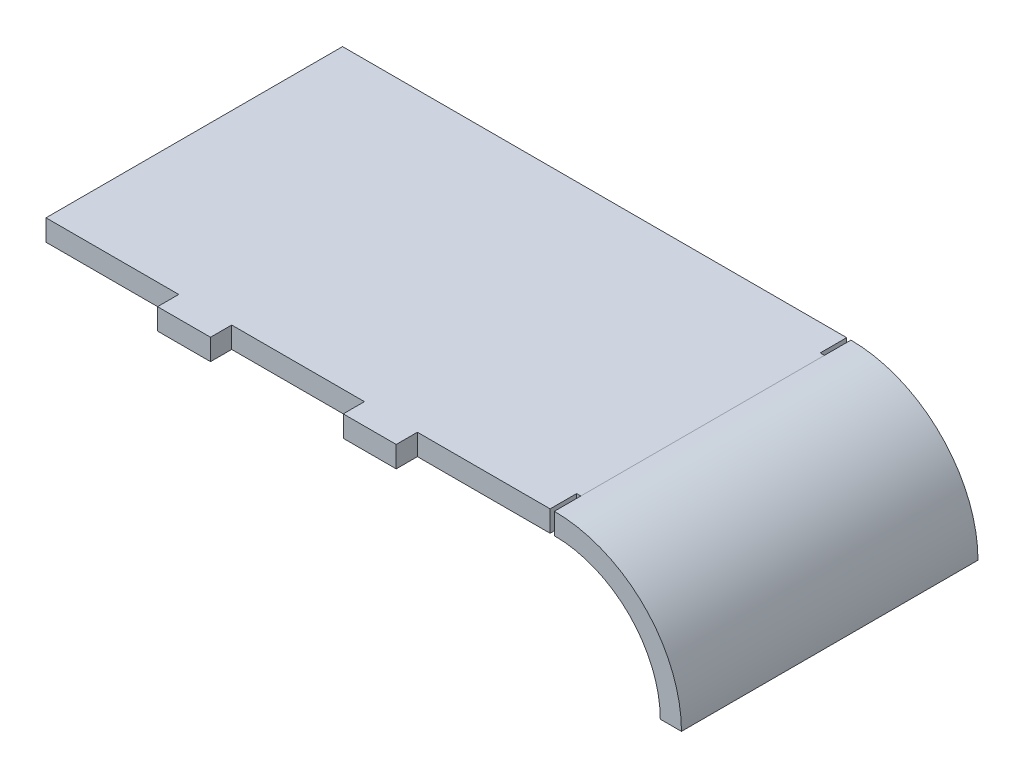
ISO-10303-21;
HEADER;
FILE_DESCRIPTION(('STEP AP214'),'2;1');
FILE_NAME('part.step','',(''),(''),'','','');
FILE_SCHEMA(('AUTOMOTIVE_DESIGN { 1 0 10303 214 1 1 1 1 }'));
ENDSEC;
DATA;
#1=APPLICATION_CONTEXT('core data for automotive mechanical design processes');
#2=APPLICATION_PROTOCOL_DEFINITION('international standard','automotive_design',2000,#1);
#3=PRODUCT_CONTEXT('',#1,'mechanical');
#4=PRODUCT('Part','Part','',(#3));
#5=PRODUCT_RELATED_PRODUCT_CATEGORY('part','',(#4));
#6=PRODUCT_DEFINITION_FORMATION('','',#4);
#7=PRODUCT_DEFINITION_CONTEXT('part definition',#1,'design');
#8=PRODUCT_DEFINITION('design','',#6,#7);
#9=PRODUCT_DEFINITION_SHAPE('','',#8);
#10=(LENGTH_UNIT() NAMED_UNIT(*) SI_UNIT(.MILLI.,.METRE.));
#11=(NAMED_UNIT(*) PLANE_ANGLE_UNIT() SI_UNIT($,.RADIAN.));
#12=(NAMED_UNIT(*) SI_UNIT($,.STERADIAN.) SOLID_ANGLE_UNIT());
#13=UNCERTAINTY_MEASURE_WITH_UNIT(LENGTH_MEASURE(1.E-05),#10,'distance_accuracy_value','');
#14=(GEOMETRIC_REPRESENTATION_CONTEXT(3) GLOBAL_UNCERTAINTY_ASSIGNED_CONTEXT((#13)) GLOBAL_UNIT_ASSIGNED_CONTEXT((#10,
#11,#12)) REPRESENTATION_CONTEXT('',''));
#15=CARTESIAN_POINT('',(0.,0.,0.));
#16=DIRECTION('',(0.,0.,1.));
#17=DIRECTION('',(1.,0.,0.));
#18=AXIS2_PLACEMENT_3D('',#15,#16,#17);
#19=CARTESIAN_POINT('',(652.,462.,20.));
#20=DIRECTION('',(0.,1.,0.));
#21=DIRECTION('',(0.,0.,1.));
#22=AXIS2_PLACEMENT_3D('',#19,#20,#21);
#23=PLANE('',#22);
#24=DIRECTION('',(0.,0.,1.));
#25=VECTOR('',#24,1.);
#26=CARTESIAN_POINT('',(699.6,462.,20.));
#27=LINE('',#26,#25);
#28=CARTESIAN_POINT('',(699.6,462.,420.));
#29=VERTEX_POINT('',#28);
#30=CARTESIAN_POINT('',(699.6,462.,422.5));
#31=VERTEX_POINT('',#30);
#32=EDGE_CURVE('E307',#29,#31,#27,.T.);
#33=ORIENTED_EDGE('',*,*,#32,.F.);
#34=DIRECTION('',(-1.,0.,0.));
#35=VECTOR('',#34,1.);
#36=CARTESIAN_POINT('',(652.,462.,420.));
#37=LINE('',#36,#35);
#38=CARTESIAN_POINT('',(652.,462.,420.));
#39=VERTEX_POINT('',#38);
#40=EDGE_CURVE('E64',#29,#39,#37,.T.);
#41=ORIENTED_EDGE('',*,*,#40,.T.);
#42=DIRECTION('',(0.,0.,1.));
#43=VECTOR('',#42,1.);
#44=CARTESIAN_POINT('',(652.,462.,20.));
#45=LINE('',#44,#43);
#46=CARTESIAN_POINT('',(652.,462.,448.));
#47=VERTEX_POINT('',#46);
#48=EDGE_CURVE('E431',#39,#47,#45,.T.);
#49=ORIENTED_EDGE('',*,*,#48,.T.);
#50=DIRECTION('',(1.,0.,0.));
#51=VECTOR('',#50,1.);
#52=CARTESIAN_POINT('',(650.,462.,448.));
#53=LINE('',#52,#51);
#54=CARTESIAN_POINT('',(664.533333333333,462.,448.));
#55=VERTEX_POINT('',#54);
#56=EDGE_CURVE('E424',#47,#55,#53,.T.);
#57=ORIENTED_EDGE('',*,*,#56,.T.);
#58=DIRECTION('',(0.,0.,-1.));
#59=VECTOR('',#58,1.);
#60=CARTESIAN_POINT('',(664.533333333333,462.,448.));
#61=LINE('',#60,#59);
#62=CARTESIAN_POINT('',(664.533333333333,462.,450.));
#63=VERTEX_POINT('',#62);
#64=EDGE_CURVE('E430',#63,#55,#61,.T.);
#65=ORIENTED_EDGE('',*,*,#64,.F.);
#66=DIRECTION('',(-1.,0.,0.));
#67=VECTOR('',#66,1.);
#68=CARTESIAN_POINT('',(664.533333333333,462.,450.));
#69=LINE('',#68,#67);
#70=CARTESIAN_POINT('',(669.533333333333,462.,450.));
#71=VERTEX_POINT('',#70);
#72=EDGE_CURVE('E434',#71,#63,#69,.T.);
#73=ORIENTED_EDGE('',*,*,#72,.F.);
#74=DIRECTION('',(0.,0.,1.));
#75=VECTOR('',#74,1.);
#76=CARTESIAN_POINT('',(669.533333333333,462.,448.));
#77=LINE('',#76,#75);
#78=CARTESIAN_POINT('',(669.533333333333,462.,448.));
#79=VERTEX_POINT('',#78);
#80=EDGE_CURVE('E429',#79,#71,#77,.T.);
#81=ORIENTED_EDGE('',*,*,#80,.F.);
#82=CARTESIAN_POINT('',(682.066666666667,462.,448.));
#83=VERTEX_POINT('',#82);
#84=EDGE_CURVE('E423',#79,#83,#53,.T.);
#85=ORIENTED_EDGE('',*,*,#84,.T.);
#86=DIRECTION('',(0.,0.,-1.));
#87=VECTOR('',#86,1.);
#88=CARTESIAN_POINT('',(682.066666666667,462.,448.));
#89=LINE('',#88,#87);
#90=CARTESIAN_POINT('',(682.066666666667,462.,450.));
#91=VERTEX_POINT('',#90);
#92=EDGE_CURVE('E428',#91,#83,#89,.T.);
#93=ORIENTED_EDGE('',*,*,#92,.F.);
#94=DIRECTION('',(-1.,0.,0.));
#95=VECTOR('',#94,1.);
#96=CARTESIAN_POINT('',(682.066666666667,462.,450.));
#97=LINE('',#96,#95);
#98=CARTESIAN_POINT('',(687.066666666667,462.,450.));
#99=VERTEX_POINT('',#98);
#100=EDGE_CURVE('E425',#99,#91,#97,.T.);
#101=ORIENTED_EDGE('',*,*,#100,.F.);
#102=DIRECTION('',(0.,0.,1.));
#103=VECTOR('',#102,1.);
#104=CARTESIAN_POINT('',(687.066666666667,462.,448.));
#105=LINE('',#104,#103);
#106=CARTESIAN_POINT('',(687.066666666667,462.,448.));
#107=VERTEX_POINT('',#106);
#108=EDGE_CURVE('E421',#107,#99,#105,.T.);
#109=ORIENTED_EDGE('',*,*,#108,.F.);
#110=CARTESIAN_POINT('',(699.6,462.,448.));
#111=VERTEX_POINT('',#110);
#112=EDGE_CURVE('E419',#107,#111,#53,.T.);
#113=ORIENTED_EDGE('',*,*,#112,.T.);
#114=DIRECTION('',(0.,0.,1.));
#115=VECTOR('',#114,1.);
#116=CARTESIAN_POINT('',(699.6,462.,20.));
#117=LINE('',#116,#115);
#118=CARTESIAN_POINT('',(699.6,462.,445.5));
#119=VERTEX_POINT('',#118);
#120=EDGE_CURVE('E337',#119,#111,#117,.T.);
#121=ORIENTED_EDGE('',*,*,#120,.F.);
#122=DIRECTION('',(-1.,0.,0.));
#123=VECTOR('',#122,1.);
#124=CARTESIAN_POINT('',(652.,462.,445.5));
#125=LINE('',#124,#123);
#126=CARTESIAN_POINT('',(700.,462.,445.5));
#127=VERTEX_POINT('',#126);
#128=EDGE_CURVE('E333',#127,#119,#125,.T.);
#129=ORIENTED_EDGE('',*,*,#128,.F.);
#130=DIRECTION('',(0.,0.,1.));
#131=VECTOR('',#130,1.);
#132=CARTESIAN_POINT('',(700.,462.,20.));
#133=LINE('',#132,#131);
#134=CARTESIAN_POINT('',(700.,462.,422.5));
#135=VERTEX_POINT('',#134);
#136=EDGE_CURVE('E336',#135,#127,#133,.T.);
#137=ORIENTED_EDGE('',*,*,#136,.F.);
#138=DIRECTION('',(1.,0.,0.));
#139=VECTOR('',#138,1.);
#140=CARTESIAN_POINT('',(652.,462.,422.5));
#141=LINE('',#140,#139);
#142=EDGE_CURVE('E323',#31,#135,#141,.T.);
#143=ORIENTED_EDGE('',*,*,#142,.F.);
#144=EDGE_LOOP('',(#33,#41,#49,#57,#65,#73,#81,#85,#93,#101,#109,#113,#121,#129,#137,#143));
#145=FACE_BOUND('',#144,.T.);
#146=ADVANCED_FACE('F49',(#145),#23,.T.);
#147=CARTESIAN_POINT('',(652.,346.792226415321,420.));
#148=DIRECTION('',(0.,0.,1.));
#149=DIRECTION('',(1.,0.,0.));
#150=AXIS2_PLACEMENT_3D('',#147,#148,#149);
#151=PLANE('',#150);
#152=ORIENTED_EDGE('',*,*,#40,.F.);
#153=DIRECTION('',(0.,1.,0.));
#154=VECTOR('',#153,1.);
#155=CARTESIAN_POINT('',(699.6,346.792226415321,420.));
#156=LINE('',#155,#154);
#157=CARTESIAN_POINT('',(699.6,460.,420.));
#158=VERTEX_POINT('',#157);
#159=EDGE_CURVE('E13',#158,#29,#156,.T.);
#160=ORIENTED_EDGE('',*,*,#159,.F.);
#161=DIRECTION('',(1.,0.,0.));
#162=VECTOR('',#161,1.);
#163=CARTESIAN_POINT('',(652.,460.,420.));
#164=LINE('',#163,#162);
#165=CARTESIAN_POINT('',(652.,460.,420.));
#166=VERTEX_POINT('',#165);
#167=EDGE_CURVE('E319',#166,#158,#164,.T.);
#168=ORIENTED_EDGE('',*,*,#167,.F.);
#169=DIRECTION('',(0.,1.,0.));
#170=VECTOR('',#169,1.);
#171=CARTESIAN_POINT('',(652.,346.792226415321,420.));
#172=LINE('',#171,#170);
#173=EDGE_CURVE('E393',#166,#39,#172,.T.);
#174=ORIENTED_EDGE('',*,*,#173,.T.);
#175=EDGE_LOOP('',(#152,#160,#168,#174));
#176=FACE_BOUND('',#175,.T.);
#177=ADVANCED_FACE('F51',(#176),#151,.F.);
#178=CARTESIAN_POINT('',(699.6,346.792226415321,417.5));
#179=DIRECTION('',(1.,0.,0.));
#180=DIRECTION('',(0.,0.,-1.));
#181=AXIS2_PLACEMENT_3D('',#178,#179,#180);
#182=PLANE('',#181);
#183=ORIENTED_EDGE('',*,*,#159,.T.);
#184=ORIENTED_EDGE('',*,*,#32,.T.);
#185=DIRECTION('',(0.,1.,0.));
#186=VECTOR('',#185,1.);
#187=CARTESIAN_POINT('',(699.6,346.792226415321,422.5));
#188=LINE('',#187,#186);
#189=CARTESIAN_POINT('',(699.6,460.,422.5));
#190=VERTEX_POINT('',#189);
#191=EDGE_CURVE('E57',#190,#31,#188,.T.);
#192=ORIENTED_EDGE('',*,*,#191,.F.);
#193=DIRECTION('',(0.,0.,-1.));
#194=VECTOR('',#193,1.);
#195=CARTESIAN_POINT('',(699.6,460.,417.5));
#196=LINE('',#195,#194);
#197=EDGE_CURVE('E71',#190,#158,#196,.T.);
#198=ORIENTED_EDGE('',*,*,#197,.T.);
#199=EDGE_LOOP('',(#183,#184,#192,#198));
#200=FACE_BOUND('',#199,.T.);
#201=ADVANCED_FACE('F509',(#200),#182,.T.);
#202=CARTESIAN_POINT('',(700.,346.792226415321,422.5));
#203=DIRECTION('',(0.,0.,-1.));
#204=DIRECTION('',(-1.,0.,0.));
#205=AXIS2_PLACEMENT_3D('',#202,#203,#204);
#206=PLANE('',#205);
#207=ORIENTED_EDGE('',*,*,#191,.T.);
#208=ORIENTED_EDGE('',*,*,#142,.T.);
#209=DIRECTION('',(0.,1.,0.));
#210=VECTOR('',#209,1.);
#211=CARTESIAN_POINT('',(700.,346.792226415321,422.5));
#212=LINE('',#211,#210);
#213=CARTESIAN_POINT('',(700.,460.,422.5));
#214=VERTEX_POINT('',#213);
#215=EDGE_CURVE('E352',#214,#135,#212,.T.);
#216=ORIENTED_EDGE('',*,*,#215,.F.);
#217=DIRECTION('',(-1.,0.,0.));
#218=VECTOR('',#217,1.);
#219=CARTESIAN_POINT('',(700.,460.,422.5));
#220=LINE('',#219,#218);
#221=EDGE_CURVE('E249',#214,#190,#220,.T.);
#222=ORIENTED_EDGE('',*,*,#221,.T.);
#223=EDGE_LOOP('',(#207,#208,#216,#222));
#224=FACE_BOUND('',#223,.T.);
#225=ADVANCED_FACE('F501',(#224),#206,.T.);
#226=CARTESIAN_POINT('',(700.,346.792226415321,445.5));
#227=DIRECTION('',(0.,0.,1.));
#228=DIRECTION('',(1.,0.,0.));
#229=AXIS2_PLACEMENT_3D('',#226,#227,#228);
#230=PLANE('',#229);
#231=DIRECTION('',(0.,1.,0.));
#232=VECTOR('',#231,1.);
#233=CARTESIAN_POINT('',(700.,346.792226415321,445.5));
#234=LINE('',#233,#232);
#235=CARTESIAN_POINT('',(700.,460.,445.5));
#236=VERTEX_POINT('',#235);
#237=EDGE_CURVE('E356',#236,#127,#234,.T.);
#238=ORIENTED_EDGE('',*,*,#237,.T.);
#239=ORIENTED_EDGE('',*,*,#128,.T.);
#240=DIRECTION('',(0.,1.,0.));
#241=VECTOR('',#240,1.);
#242=CARTESIAN_POINT('',(699.6,346.792226415321,445.5));
#243=LINE('',#242,#241);
#244=CARTESIAN_POINT('',(699.6,460.,445.5));
#245=VERTEX_POINT('',#244);
#246=EDGE_CURVE('E359',#245,#119,#243,.T.);
#247=ORIENTED_EDGE('',*,*,#246,.F.);
#248=DIRECTION('',(1.,0.,0.));
#249=VECTOR('',#248,1.);
#250=CARTESIAN_POINT('',(700.,460.,445.5));
#251=LINE('',#250,#249);
#252=EDGE_CURVE('E248',#245,#236,#251,.T.);
#253=ORIENTED_EDGE('',*,*,#252,.T.);
#254=EDGE_LOOP('',(#238,#239,#247,#253));
#255=FACE_BOUND('',#254,.T.);
#256=ADVANCED_FACE('F490',(#255),#230,.T.);
#257=CARTESIAN_POINT('',(699.6,346.792226415321,450.5));
#258=DIRECTION('',(1.,0.,0.));
#259=DIRECTION('',(0.,0.,-1.));
#260=AXIS2_PLACEMENT_3D('',#257,#258,#259);
#261=PLANE('',#260);
#262=ORIENTED_EDGE('',*,*,#246,.T.);
#263=ORIENTED_EDGE('',*,*,#120,.T.);
#264=DIRECTION('',(0.,1.,0.));
#265=VECTOR('',#264,1.);
#266=CARTESIAN_POINT('',(699.6,346.792226415321,448.));
#267=LINE('',#266,#265);
#268=CARTESIAN_POINT('',(699.6,460.,448.));
#269=VERTEX_POINT('',#268);
#270=EDGE_CURVE('E364',#269,#111,#267,.T.);
#271=ORIENTED_EDGE('',*,*,#270,.F.);
#272=DIRECTION('',(0.,0.,-1.));
#273=VECTOR('',#272,1.);
#274=CARTESIAN_POINT('',(699.6,460.,450.5));
#275=LINE('',#274,#273);
#276=EDGE_CURVE('E254',#269,#245,#275,.T.);
#277=ORIENTED_EDGE('',*,*,#276,.T.);
#278=EDGE_LOOP('',(#262,#263,#271,#277));
#279=FACE_BOUND('',#278,.T.);
#280=ADVANCED_FACE('F493',(#279),#261,.T.);
#281=CARTESIAN_POINT('',(-700.,346.792226415321,448.));
#282=DIRECTION('',(0.,0.,-1.));
#283=DIRECTION('',(-1.,0.,0.));
#284=AXIS2_PLACEMENT_3D('',#281,#282,#283);
#285=PLANE('',#284);
#286=ORIENTED_EDGE('',*,*,#112,.F.);
#287=DIRECTION('',(0.,1.,0.));
#288=VECTOR('',#287,1.);
#289=CARTESIAN_POINT('',(687.066666666667,346.792226415321,448.));
#290=LINE('',#289,#288);
#291=CARTESIAN_POINT('',(687.066666666667,460.,448.));
#292=VERTEX_POINT('',#291);
#293=EDGE_CURVE('E367',#292,#107,#290,.T.);
#294=ORIENTED_EDGE('',*,*,#293,.F.);
#295=DIRECTION('',(-1.,0.,0.));
#296=VECTOR('',#295,1.);
#297=CARTESIAN_POINT('',(-700.,460.,448.));
#298=LINE('',#297,#296);
#299=EDGE_CURVE('E265',#269,#292,#298,.T.);
#300=ORIENTED_EDGE('',*,*,#299,.F.);
#301=ORIENTED_EDGE('',*,*,#270,.T.);
#302=EDGE_LOOP('',(#286,#294,#300,#301));
#303=FACE_BOUND('',#302,.T.);
#304=ADVANCED_FACE('F417',(#303),#285,.F.);
#305=CARTESIAN_POINT('',(687.066666666667,346.792226415321,448.));
#306=DIRECTION('',(-1.,0.,0.));
#307=DIRECTION('',(0.,0.,1.));
#308=AXIS2_PLACEMENT_3D('',#305,#306,#307);
#309=PLANE('',#308);
#310=ORIENTED_EDGE('',*,*,#108,.T.);
#311=DIRECTION('',(0.,1.,0.));
#312=VECTOR('',#311,1.);
#313=CARTESIAN_POINT('',(687.066666666667,346.792226415321,450.));
#314=LINE('',#313,#312);
#315=CARTESIAN_POINT('',(687.066666666667,460.,450.));
#316=VERTEX_POINT('',#315);
#317=EDGE_CURVE('E370',#316,#99,#314,.T.);
#318=ORIENTED_EDGE('',*,*,#317,.F.);
#319=DIRECTION('',(0.,0.,1.));
#320=VECTOR('',#319,1.);
#321=CARTESIAN_POINT('',(687.066666666667,460.,448.));
#322=LINE('',#321,#320);
#323=EDGE_CURVE('E268',#292,#316,#322,.T.);
#324=ORIENTED_EDGE('',*,*,#323,.F.);
#325=ORIENTED_EDGE('',*,*,#293,.T.);
#326=EDGE_LOOP('',(#310,#318,#324,#325));
#327=FACE_BOUND('',#326,.T.);
#328=ADVANCED_FACE('F414',(#327),#309,.F.);
#329=CARTESIAN_POINT('',(682.066666666667,346.792226415321,450.));
#330=DIRECTION('',(0.,0.,-1.));
#331=DIRECTION('',(-1.,0.,0.));
#332=AXIS2_PLACEMENT_3D('',#329,#330,#331);
#333=PLANE('',#332);
#334=ORIENTED_EDGE('',*,*,#100,.T.);
#335=DIRECTION('',(0.,1.,0.));
#336=VECTOR('',#335,1.);
#337=CARTESIAN_POINT('',(682.066666666667,346.792226415321,450.));
#338=LINE('',#337,#336);
#339=CARTESIAN_POINT('',(682.066666666667,460.,450.));
#340=VERTEX_POINT('',#339);
#341=EDGE_CURVE('E373',#340,#91,#338,.T.);
#342=ORIENTED_EDGE('',*,*,#341,.F.);
#343=DIRECTION('',(-1.,0.,0.));
#344=VECTOR('',#343,1.);
#345=CARTESIAN_POINT('',(682.066666666667,460.,450.));
#346=LINE('',#345,#344);
#347=EDGE_CURVE('E404',#316,#340,#346,.T.);
#348=ORIENTED_EDGE('',*,*,#347,.F.);
#349=ORIENTED_EDGE('',*,*,#317,.T.);
#350=EDGE_LOOP('',(#334,#342,#348,#349));
#351=FACE_BOUND('',#350,.T.);
#352=ADVANCED_FACE('F525',(#351),#333,.F.);
#353=CARTESIAN_POINT('',(682.066666666667,346.792226415321,448.));
#354=DIRECTION('',(1.,0.,0.));
#355=DIRECTION('',(0.,0.,-1.));
#356=AXIS2_PLACEMENT_3D('',#353,#354,#355);
#357=PLANE('',#356);
#358=ORIENTED_EDGE('',*,*,#92,.T.);
#359=DIRECTION('',(0.,1.,0.));
#360=VECTOR('',#359,1.);
#361=CARTESIAN_POINT('',(682.066666666667,346.792226415321,448.));
#362=LINE('',#361,#360);
#363=CARTESIAN_POINT('',(682.066666666667,460.,448.));
#364=VERTEX_POINT('',#363);
#365=EDGE_CURVE('E376',#364,#83,#362,.T.);
#366=ORIENTED_EDGE('',*,*,#365,.F.);
#367=DIRECTION('',(0.,0.,-1.));
#368=VECTOR('',#367,1.);
#369=CARTESIAN_POINT('',(682.066666666667,460.,448.));
#370=LINE('',#369,#368);
#371=EDGE_CURVE('E288',#340,#364,#370,.T.);
#372=ORIENTED_EDGE('',*,*,#371,.F.);
#373=ORIENTED_EDGE('',*,*,#341,.T.);
#374=EDGE_LOOP('',(#358,#366,#372,#373));
#375=FACE_BOUND('',#374,.T.);
#376=ADVANCED_FACE('F462',(#375),#357,.F.);
#377=ORIENTED_EDGE('',*,*,#84,.F.);
#378=DIRECTION('',(0.,1.,0.));
#379=VECTOR('',#378,1.);
#380=CARTESIAN_POINT('',(669.533333333333,346.792226415321,448.));
#381=LINE('',#380,#379);
#382=CARTESIAN_POINT('',(669.533333333333,460.,448.));
#383=VERTEX_POINT('',#382);
#384=EDGE_CURVE('E379',#383,#79,#381,.T.);
#385=ORIENTED_EDGE('',*,*,#384,.F.);
#386=EDGE_CURVE('E270',#364,#383,#298,.T.);
#387=ORIENTED_EDGE('',*,*,#386,.F.);
#388=ORIENTED_EDGE('',*,*,#365,.T.);
#389=EDGE_LOOP('',(#377,#385,#387,#388));
#390=FACE_BOUND('',#389,.T.);
#391=ADVANCED_FACE('F465',(#390),#285,.F.);
#392=CARTESIAN_POINT('',(669.533333333333,346.792226415321,448.));
#393=DIRECTION('',(-1.,0.,0.));
#394=DIRECTION('',(0.,0.,1.));
#395=AXIS2_PLACEMENT_3D('',#392,#393,#394);
#396=PLANE('',#395);
#397=ORIENTED_EDGE('',*,*,#80,.T.);
#398=DIRECTION('',(0.,1.,0.));
#399=VECTOR('',#398,1.);
#400=CARTESIAN_POINT('',(669.533333333333,346.792226415321,450.));
#401=LINE('',#400,#399);
#402=CARTESIAN_POINT('',(669.533333333333,460.,450.));
#403=VERTEX_POINT('',#402);
#404=EDGE_CURVE('E382',#403,#71,#401,.T.);
#405=ORIENTED_EDGE('',*,*,#404,.F.);
#406=DIRECTION('',(0.,0.,1.));
#407=VECTOR('',#406,1.);
#408=CARTESIAN_POINT('',(669.533333333333,460.,448.));
#409=LINE('',#408,#407);
#410=EDGE_CURVE('E284',#383,#403,#409,.T.);
#411=ORIENTED_EDGE('',*,*,#410,.F.);
#412=ORIENTED_EDGE('',*,*,#384,.T.);
#413=EDGE_LOOP('',(#397,#405,#411,#412));
#414=FACE_BOUND('',#413,.T.);
#415=ADVANCED_FACE('F468',(#414),#396,.F.);
#416=CARTESIAN_POINT('',(664.533333333333,346.792226415321,450.));
#417=DIRECTION('',(0.,0.,-1.));
#418=DIRECTION('',(-1.,0.,0.));
#419=AXIS2_PLACEMENT_3D('',#416,#417,#418);
#420=PLANE('',#419);
#421=ORIENTED_EDGE('',*,*,#72,.T.);
#422=DIRECTION('',(0.,1.,0.));
#423=VECTOR('',#422,1.);
#424=CARTESIAN_POINT('',(664.533333333333,346.792226415321,450.));
#425=LINE('',#424,#423);
#426=CARTESIAN_POINT('',(664.533333333333,460.,450.));
#427=VERTEX_POINT('',#426);
#428=EDGE_CURVE('E385',#427,#63,#425,.T.);
#429=ORIENTED_EDGE('',*,*,#428,.F.);
#430=DIRECTION('',(-1.,0.,0.));
#431=VECTOR('',#430,1.);
#432=CARTESIAN_POINT('',(664.533333333333,460.,450.));
#433=LINE('',#432,#431);
#434=EDGE_CURVE('E287',#403,#427,#433,.T.);
#435=ORIENTED_EDGE('',*,*,#434,.F.);
#436=ORIENTED_EDGE('',*,*,#404,.T.);
#437=EDGE_LOOP('',(#421,#429,#435,#436));
#438=FACE_BOUND('',#437,.T.);
#439=ADVANCED_FACE('F472',(#438),#420,.F.);
#440=CARTESIAN_POINT('',(664.533333333333,346.792226415321,448.));
#441=DIRECTION('',(1.,0.,0.));
#442=DIRECTION('',(0.,0.,-1.));
#443=AXIS2_PLACEMENT_3D('',#440,#441,#442);
#444=PLANE('',#443);
#445=ORIENTED_EDGE('',*,*,#64,.T.);
#446=DIRECTION('',(0.,1.,0.));
#447=VECTOR('',#446,1.);
#448=CARTESIAN_POINT('',(664.533333333333,346.792226415321,448.));
#449=LINE('',#448,#447);
#450=CARTESIAN_POINT('',(664.533333333333,460.,448.));
#451=VERTEX_POINT('',#450);
#452=EDGE_CURVE('E388',#451,#55,#449,.T.);
#453=ORIENTED_EDGE('',*,*,#452,.F.);
#454=DIRECTION('',(0.,0.,-1.));
#455=VECTOR('',#454,1.);
#456=CARTESIAN_POINT('',(664.533333333333,460.,448.));
#457=LINE('',#456,#455);
#458=EDGE_CURVE('E293',#427,#451,#457,.T.);
#459=ORIENTED_EDGE('',*,*,#458,.F.);
#460=ORIENTED_EDGE('',*,*,#428,.T.);
#461=EDGE_LOOP('',(#445,#453,#459,#460));
#462=FACE_BOUND('',#461,.T.);
#463=ADVANCED_FACE('F474',(#462),#444,.F.);
#464=ORIENTED_EDGE('',*,*,#56,.F.);
#465=DIRECTION('',(0.,1.,0.));
#466=VECTOR('',#465,1.);
#467=CARTESIAN_POINT('',(652.,346.792226415321,448.));
#468=LINE('',#467,#466);
#469=CARTESIAN_POINT('',(652.,460.,448.));
#470=VERTEX_POINT('',#469);
#471=EDGE_CURVE('E391',#470,#47,#468,.T.);
#472=ORIENTED_EDGE('',*,*,#471,.F.);
#473=EDGE_CURVE('E269',#451,#470,#298,.T.);
#474=ORIENTED_EDGE('',*,*,#473,.F.);
#475=ORIENTED_EDGE('',*,*,#452,.T.);
#476=EDGE_LOOP('',(#464,#472,#474,#475));
#477=FACE_BOUND('',#476,.T.);
#478=ADVANCED_FACE('F477',(#477),#285,.F.);
#479=CARTESIAN_POINT('',(652.,346.792226415321,-52.2999999999999));
#480=DIRECTION('',(-1.,0.,0.));
#481=DIRECTION('',(0.,0.,1.));
#482=AXIS2_PLACEMENT_3D('',#479,#480,#481);
#483=PLANE('',#482);
#484=ORIENTED_EDGE('',*,*,#471,.T.);
#485=ORIENTED_EDGE('',*,*,#48,.F.);
#486=ORIENTED_EDGE('',*,*,#173,.F.);
#487=DIRECTION('',(0.,0.,1.));
#488=VECTOR('',#487,1.);
#489=CARTESIAN_POINT('',(652.,460.,-52.2999999999999));
#490=LINE('',#489,#488);
#491=EDGE_CURVE('E297',#166,#470,#490,.T.);
#492=ORIENTED_EDGE('',*,*,#491,.T.);
#493=EDGE_LOOP('',(#484,#485,#486,#492));
#494=FACE_BOUND('',#493,.T.);
#495=ADVANCED_FACE('F478',(#494),#483,.T.);
#496=CARTESIAN_POINT('',(-700.,460.,-613.896540189728));
#497=DIRECTION('',(0.,1.,0.));
#498=DIRECTION('',(0.,0.,1.));
#499=AXIS2_PLACEMENT_3D('',#496,#497,#498);
#500=PLANE('',#499);
#501=ORIENTED_EDGE('',*,*,#167,.T.);
#502=ORIENTED_EDGE('',*,*,#197,.F.);
#503=ORIENTED_EDGE('',*,*,#221,.F.);
#504=DIRECTION('',(0.,0.,1.));
#505=VECTOR('',#504,1.);
#506=CARTESIAN_POINT('',(700.,460.,-613.896540189728));
#507=LINE('',#506,#505);
#508=EDGE_CURVE('E243',#214,#236,#507,.T.);
#509=ORIENTED_EDGE('',*,*,#508,.T.);
#510=ORIENTED_EDGE('',*,*,#252,.F.);
#511=ORIENTED_EDGE('',*,*,#276,.F.);
#512=ORIENTED_EDGE('',*,*,#299,.T.);
#513=ORIENTED_EDGE('',*,*,#323,.T.);
#514=ORIENTED_EDGE('',*,*,#347,.T.);
#515=ORIENTED_EDGE('',*,*,#371,.T.);
#516=ORIENTED_EDGE('',*,*,#386,.T.);
#517=ORIENTED_EDGE('',*,*,#410,.T.);
#518=ORIENTED_EDGE('',*,*,#434,.T.);
#519=ORIENTED_EDGE('',*,*,#458,.T.);
#520=ORIENTED_EDGE('',*,*,#473,.T.);
#521=ORIENTED_EDGE('',*,*,#491,.F.);
#522=EDGE_LOOP('',(#501,#502,#503,#509,#510,#511,#512,#513,#514,#515,#516,#517,#518,#519,#520,#521));
#523=FACE_BOUND('',#522,.T.);
#524=ADVANCED_FACE('F408',(#523),#500,.F.);
#525=CARTESIAN_POINT('',(700.,461.,446.75));
#526=DIRECTION('',(-1.,0.,0.));
#527=DIRECTION('',(0.,0.,1.));
#528=AXIS2_PLACEMENT_3D('',#525,#526,#527);
#529=PLANE('',#528);
#530=ORIENTED_EDGE('',*,*,#237,.F.);
#531=DIRECTION('',(0.,0.,1.));
#532=VECTOR('',#531,1.);
#533=CARTESIAN_POINT('',(700.,460.,349.379863961251));
#534=LINE('',#533,#532);
#535=CARTESIAN_POINT('',(700.,460.,448.));
#536=VERTEX_POINT('',#535);
#537=EDGE_CURVE('E214',#236,#536,#534,.T.);
#538=ORIENTED_EDGE('',*,*,#537,.T.);
#539=DIRECTION('',(0.,1.,0.));
#540=VECTOR('',#539,1.);
#541=CARTESIAN_POINT('',(700.,461.,448.));
#542=LINE('',#541,#540);
#543=CARTESIAN_POINT('',(700.,462.,448.));
#544=VERTEX_POINT('',#543);
#545=EDGE_CURVE('E304',#536,#544,#542,.T.);
#546=ORIENTED_EDGE('',*,*,#545,.T.);
#547=DIRECTION('',(0.,0.,1.));
#548=VECTOR('',#547,1.);
#549=CARTESIAN_POINT('',(700.,462.,349.379863961251));
#550=LINE('',#549,#548);
#551=EDGE_CURVE('E344',#127,#544,#550,.T.);
#552=ORIENTED_EDGE('',*,*,#551,.F.);
#553=EDGE_LOOP('',(#530,#538,#546,#552));
#554=FACE_BOUND('',#553,.T.);
#555=ADVANCED_FACE('F487',(#554),#529,.T.);
#556=CARTESIAN_POINT('',(700.,450.,448.));
#557=DIRECTION('',(0.,0.,-1.));
#558=DIRECTION('',(-1.,0.,0.));
#559=AXIS2_PLACEMENT_3D('',#556,#557,#558);
#560=PLANE('',#559);
#561=ORIENTED_EDGE('',*,*,#545,.F.);
#562=CARTESIAN_POINT('',(700.,450.,448.));
#563=DIRECTION('',(0.,0.,1.));
#564=DIRECTION('',(1.,0.,0.));
#565=AXIS2_PLACEMENT_3D('',#562,#563,#564);
#566=CIRCLE('',#565,9.99999999999997);
#567=CARTESIAN_POINT('',(710.,450.,448.));
#568=VERTEX_POINT('',#567);
#569=EDGE_CURVE('E230',#568,#536,#566,.T.);
#570=ORIENTED_EDGE('',*,*,#569,.F.);
#571=DIRECTION('',(1.,0.,0.));
#572=VECTOR('',#571,1.);
#573=CARTESIAN_POINT('',(711.,450.,448.));
#574=LINE('',#573,#572);
#575=CARTESIAN_POINT('',(712.,450.,448.));
#576=VERTEX_POINT('',#575);
#577=EDGE_CURVE('E197',#568,#576,#574,.T.);
#578=ORIENTED_EDGE('',*,*,#577,.T.);
#579=CARTESIAN_POINT('',(700.,450.,448.));
#580=DIRECTION('',(0.,0.,1.));
#581=DIRECTION('',(1.,0.,0.));
#582=AXIS2_PLACEMENT_3D('',#579,#580,#581);
#583=CIRCLE('',#582,11.9999999999999);
#584=EDGE_CURVE('E208',#576,#544,#583,.T.);
#585=ORIENTED_EDGE('',*,*,#584,.T.);
#586=EDGE_LOOP('',(#561,#570,#578,#585));
#587=FACE_BOUND('',#586,.T.);
#588=ADVANCED_FACE('F577',(#587),#560,.F.);
#589=CARTESIAN_POINT('',(711.,450.,434.));
#590=DIRECTION('',(0.,1.,0.));
#591=DIRECTION('',(0.,0.,1.));
#592=AXIS2_PLACEMENT_3D('',#589,#590,#591);
#593=PLANE('',#592);
#594=ORIENTED_EDGE('',*,*,#577,.F.);
#595=DIRECTION('',(0.,0.,1.));
#596=VECTOR('',#595,1.);
#597=CARTESIAN_POINT('',(710.,450.,349.379863961251));
#598=LINE('',#597,#596);
#599=CARTESIAN_POINT('',(710.,450.,420.));
#600=VERTEX_POINT('',#599);
#601=EDGE_CURVE('E192',#600,#568,#598,.T.);
#602=ORIENTED_EDGE('',*,*,#601,.F.);
#603=DIRECTION('',(1.,0.,0.));
#604=VECTOR('',#603,1.);
#605=CARTESIAN_POINT('',(711.,450.,420.));
#606=LINE('',#605,#604);
#607=CARTESIAN_POINT('',(712.,450.,420.));
#608=VERTEX_POINT('',#607);
#609=EDGE_CURVE('E187',#600,#608,#606,.T.);
#610=ORIENTED_EDGE('',*,*,#609,.T.);
#611=DIRECTION('',(0.,0.,1.));
#612=VECTOR('',#611,1.);
#613=CARTESIAN_POINT('',(712.,450.,349.379863961251));
#614=LINE('',#613,#612);
#615=EDGE_CURVE('E190',#608,#576,#614,.T.);
#616=ORIENTED_EDGE('',*,*,#615,.T.);
#617=EDGE_LOOP('',(#594,#602,#610,#616));
#618=FACE_BOUND('',#617,.T.);
#619=ADVANCED_FACE('F189',(#618),#593,.F.);
#620=CARTESIAN_POINT('',(700.,450.,420.));
#621=DIRECTION('',(0.,0.,1.));
#622=DIRECTION('',(1.,0.,0.));
#623=AXIS2_PLACEMENT_3D('',#620,#621,#622);
#624=PLANE('',#623);
#625=ORIENTED_EDGE('',*,*,#609,.F.);
#626=CARTESIAN_POINT('',(700.,450.,420.));
#627=DIRECTION('',(0.,0.,1.));
#628=DIRECTION('',(1.,0.,0.));
#629=AXIS2_PLACEMENT_3D('',#626,#627,#628);
#630=CIRCLE('',#629,9.99999999999997);
#631=CARTESIAN_POINT('',(700.,460.,420.));
#632=VERTEX_POINT('',#631);
#633=EDGE_CURVE('E231',#632,#600,#630,.F.);
#634=ORIENTED_EDGE('',*,*,#633,.F.);
#635=DIRECTION('',(0.,1.,0.));
#636=VECTOR('',#635,1.);
#637=CARTESIAN_POINT('',(700.,461.,420.));
#638=LINE('',#637,#636);
#639=CARTESIAN_POINT('',(700.,462.,420.));
#640=VERTEX_POINT('',#639);
#641=EDGE_CURVE('E198',#632,#640,#638,.T.);
#642=ORIENTED_EDGE('',*,*,#641,.T.);
#643=CARTESIAN_POINT('',(700.,450.,420.));
#644=DIRECTION('',(0.,0.,1.));
#645=DIRECTION('',(1.,0.,0.));
#646=AXIS2_PLACEMENT_3D('',#643,#644,#645);
#647=CIRCLE('',#646,11.9999999999999);
#648=EDGE_CURVE('E204',#640,#608,#647,.F.);
#649=ORIENTED_EDGE('',*,*,#648,.T.);
#650=EDGE_LOOP('',(#625,#634,#642,#649));
#651=FACE_BOUND('',#650,.T.);
#652=ADVANCED_FACE('F210',(#651),#624,.F.);
#653=CARTESIAN_POINT('',(700.,461.,421.25));
#654=DIRECTION('',(-1.,0.,0.));
#655=DIRECTION('',(0.,0.,1.));
#656=AXIS2_PLACEMENT_3D('',#653,#654,#655);
#657=PLANE('',#656);
#658=DIRECTION('',(0.,0.,1.));
#659=VECTOR('',#658,1.);
#660=CARTESIAN_POINT('',(700.,460.,349.379863961251));
#661=LINE('',#660,#659);
#662=EDGE_CURVE('E211',#632,#214,#661,.T.);
#663=ORIENTED_EDGE('',*,*,#662,.T.);
#664=ORIENTED_EDGE('',*,*,#215,.T.);
#665=DIRECTION('',(0.,0.,1.));
#666=VECTOR('',#665,1.);
#667=CARTESIAN_POINT('',(700.,462.,349.379863961251));
#668=LINE('',#667,#666);
#669=EDGE_CURVE('E309',#640,#135,#668,.T.);
#670=ORIENTED_EDGE('',*,*,#669,.F.);
#671=ORIENTED_EDGE('',*,*,#641,.F.);
#672=EDGE_LOOP('',(#663,#664,#670,#671));
#673=FACE_BOUND('',#672,.T.);
#674=ADVANCED_FACE('F351',(#673),#657,.T.);
#675=CARTESIAN_POINT('',(700.,450.,349.379863961251));
#676=DIRECTION('',(0.,0.,1.));
#677=DIRECTION('',(1.,0.,0.));
#678=AXIS2_PLACEMENT_3D('',#675,#676,#677);
#679=CYLINDRICAL_SURFACE('',#678,11.9999999999999);
#680=ORIENTED_EDGE('',*,*,#648,.F.);
#681=ORIENTED_EDGE('',*,*,#669,.T.);
#682=ORIENTED_EDGE('',*,*,#136,.T.);
#683=ORIENTED_EDGE('',*,*,#551,.T.);
#684=ORIENTED_EDGE('',*,*,#584,.F.);
#685=ORIENTED_EDGE('',*,*,#615,.F.);
#686=EDGE_LOOP('',(#680,#681,#682,#683,#684,#685));
#687=FACE_BOUND('',#686,.T.);
#688=ADVANCED_FACE('F202',(#687),#679,.T.);
#689=CARTESIAN_POINT('',(700.,450.,349.379863961251));
#690=DIRECTION('',(0.,0.,1.));
#691=DIRECTION('',(1.,0.,0.));
#692=AXIS2_PLACEMENT_3D('',#689,#690,#691);
#693=CYLINDRICAL_SURFACE('',#692,9.99999999999997);
#694=ORIENTED_EDGE('',*,*,#633,.T.);
#695=ORIENTED_EDGE('',*,*,#601,.T.);
#696=ORIENTED_EDGE('',*,*,#569,.T.);
#697=ORIENTED_EDGE('',*,*,#537,.F.);
#698=ORIENTED_EDGE('',*,*,#508,.F.);
#699=ORIENTED_EDGE('',*,*,#662,.F.);
#700=EDGE_LOOP('',(#694,#695,#696,#697,#698,#699));
#701=FACE_BOUND('',#700,.T.);
#702=ADVANCED_FACE('F484',(#701),#693,.F.);
#703=CLOSED_SHELL('',(#146,#177,#201,#225,#256,#280,#304,#328,#352,#376,#391,#415,#439,#463,
#478,#495,#524,#555,#588,#619,#652,#674,#688,#702));
#704=MANIFOLD_SOLID_BREP('B2',#703);
#705=ADVANCED_BREP_SHAPE_REPRESENTATION('',(#18,#704),#14);
#706=SHAPE_DEFINITION_REPRESENTATION(#9,#705);
ENDSEC;
END-ISO-10303-21;
